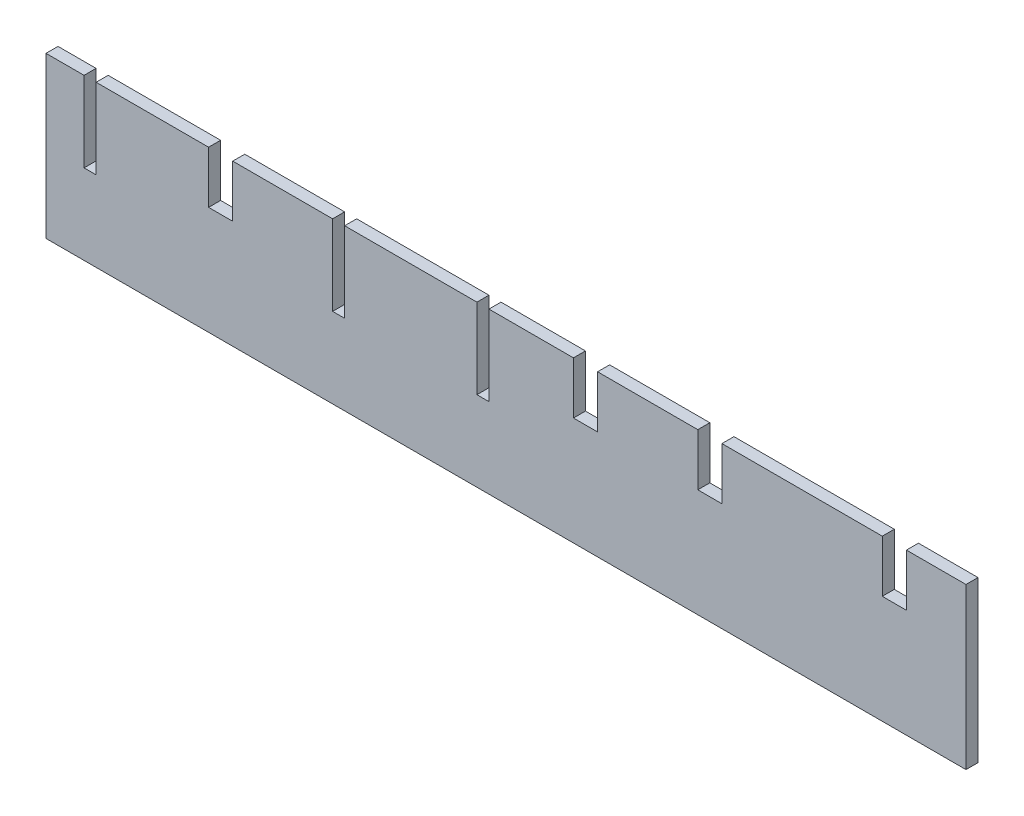
ISO-10303-21;
HEADER;
FILE_DESCRIPTION(('STEP AP214'),'2;1');
FILE_NAME('part.step','',(''),(''),'','','');
FILE_SCHEMA(('AUTOMOTIVE_DESIGN { 1 0 10303 214 1 1 1 1 }'));
ENDSEC;
DATA;
#1=APPLICATION_CONTEXT('core data for automotive mechanical design processes');
#2=APPLICATION_PROTOCOL_DEFINITION('international standard','automotive_design',2000,#1);
#3=PRODUCT_CONTEXT('',#1,'mechanical');
#4=PRODUCT('Part','Part','',(#3));
#5=PRODUCT_RELATED_PRODUCT_CATEGORY('part','',(#4));
#6=PRODUCT_DEFINITION_FORMATION('','',#4);
#7=PRODUCT_DEFINITION_CONTEXT('part definition',#1,'design');
#8=PRODUCT_DEFINITION('design','',#6,#7);
#9=PRODUCT_DEFINITION_SHAPE('','',#8);
#10=(LENGTH_UNIT() NAMED_UNIT(*) SI_UNIT(.MILLI.,.METRE.));
#11=(NAMED_UNIT(*) PLANE_ANGLE_UNIT() SI_UNIT($,.RADIAN.));
#12=(NAMED_UNIT(*) SI_UNIT($,.STERADIAN.) SOLID_ANGLE_UNIT());
#13=UNCERTAINTY_MEASURE_WITH_UNIT(LENGTH_MEASURE(1.E-05),#10,'distance_accuracy_value','');
#14=(GEOMETRIC_REPRESENTATION_CONTEXT(3) GLOBAL_UNCERTAINTY_ASSIGNED_CONTEXT((#13)) GLOBAL_UNIT_ASSIGNED_CONTEXT((#10,
#11,#12)) REPRESENTATION_CONTEXT('',''));
#15=CARTESIAN_POINT('',(0.,0.,0.));
#16=DIRECTION('',(0.,0.,1.));
#17=DIRECTION('',(1.,0.,0.));
#18=AXIS2_PLACEMENT_3D('',#15,#16,#17);
#19=CARTESIAN_POINT('',(14.16,40.,6.));
#20=DIRECTION('',(0.,-1.,0.));
#21=DIRECTION('',(0.,0.,-1.));
#22=AXIS2_PLACEMENT_3D('',#19,#20,#21);
#23=PLANE('',#22);
#24=DIRECTION('',(-1.,0.,0.));
#25=VECTOR('',#24,1.);
#26=CARTESIAN_POINT('',(14.16,40.,0.));
#27=LINE('',#26,#25);
#28=CARTESIAN_POINT('',(136.,40.,0.));
#29=VERTEX_POINT('',#28);
#30=CARTESIAN_POINT('',(70.0000000000001,40.,0.));
#31=VERTEX_POINT('',#30);
#32=EDGE_CURVE('E408',#29,#31,#27,.T.);
#33=ORIENTED_EDGE('',*,*,#32,.T.);
#34=DIRECTION('',(0.,0.,-1.));
#35=VECTOR('',#34,1.);
#36=CARTESIAN_POINT('',(70.0000000000001,40.,10.));
#37=LINE('',#36,#35);
#38=CARTESIAN_POINT('',(70.0000000000001,40.,6.));
#39=VERTEX_POINT('',#38);
#40=EDGE_CURVE('E269',#39,#31,#37,.T.);
#41=ORIENTED_EDGE('',*,*,#40,.F.);
#42=DIRECTION('',(-1.,0.,0.));
#43=VECTOR('',#42,1.);
#44=CARTESIAN_POINT('',(14.16,40.,6.));
#45=LINE('',#44,#43);
#46=CARTESIAN_POINT('',(136.,40.,6.));
#47=VERTEX_POINT('',#46);
#48=EDGE_CURVE('E362',#47,#39,#45,.T.);
#49=ORIENTED_EDGE('',*,*,#48,.F.);
#50=DIRECTION('',(0.,0.,-1.));
#51=VECTOR('',#50,1.);
#52=CARTESIAN_POINT('',(136.,40.,10.));
#53=LINE('',#52,#51);
#54=EDGE_CURVE('E306',#47,#29,#53,.T.);
#55=ORIENTED_EDGE('',*,*,#54,.T.);
#56=EDGE_LOOP('',(#33,#41,#49,#55));
#57=FACE_BOUND('',#56,.T.);
#58=ADVANCED_FACE('F37',(#57),#23,.F.);
#59=CARTESIAN_POINT('',(184.16,40.,0.));
#60=VERTEX_POINT('',#59);
#61=CARTESIAN_POINT('',(142.,40.,0.));
#62=VERTEX_POINT('',#61);
#63=EDGE_CURVE('E404',#60,#62,#27,.T.);
#64=ORIENTED_EDGE('',*,*,#63,.T.);
#65=DIRECTION('',(0.,0.,-1.));
#66=VECTOR('',#65,1.);
#67=CARTESIAN_POINT('',(142.,40.,10.));
#68=LINE('',#67,#66);
#69=CARTESIAN_POINT('',(142.,40.,6.));
#70=VERTEX_POINT('',#69);
#71=EDGE_CURVE('E285',#70,#62,#68,.T.);
#72=ORIENTED_EDGE('',*,*,#71,.F.);
#73=CARTESIAN_POINT('',(184.16,40.,6.));
#74=VERTEX_POINT('',#73);
#75=EDGE_CURVE('E358',#74,#70,#45,.T.);
#76=ORIENTED_EDGE('',*,*,#75,.F.);
#77=DIRECTION('',(0.,0.,-1.));
#78=VECTOR('',#77,1.);
#79=CARTESIAN_POINT('',(184.16,40.,6.));
#80=LINE('',#79,#78);
#81=EDGE_CURVE('E440',#74,#60,#80,.T.);
#82=ORIENTED_EDGE('',*,*,#81,.T.);
#83=EDGE_LOOP('',(#64,#72,#76,#82));
#84=FACE_BOUND('',#83,.T.);
#85=ADVANCED_FACE('F562',(#84),#23,.F.);
#86=CARTESIAN_POINT('',(-79.,40.,6.));
#87=DIRECTION('',(0.,-1.,0.));
#88=DIRECTION('',(1.,0.,0.));
#89=AXIS2_PLACEMENT_3D('',#86,#87,#88);
#90=PLANE('',#89);
#91=DIRECTION('',(-1.,0.,0.));
#92=VECTOR('',#91,1.);
#93=CARTESIAN_POINT('',(-79.,40.,6.));
#94=LINE('',#93,#92);
#95=CARTESIAN_POINT('',(-59.9999999999999,40.,6.));
#96=VERTEX_POINT('',#95);
#97=CARTESIAN_POINT('',(-79.,40.,6.));
#98=VERTEX_POINT('',#97);
#99=EDGE_CURVE('E368',#96,#98,#94,.T.);
#100=ORIENTED_EDGE('',*,*,#99,.F.);
#101=DIRECTION('',(0.,0.,-1.));
#102=VECTOR('',#101,1.);
#103=CARTESIAN_POINT('',(-59.9999999999999,40.,10.));
#104=LINE('',#103,#102);
#105=CARTESIAN_POINT('',(-59.9999999999999,40.,0.));
#106=VERTEX_POINT('',#105);
#107=EDGE_CURVE('E277',#96,#106,#104,.T.);
#108=ORIENTED_EDGE('',*,*,#107,.T.);
#109=DIRECTION('',(-1.,0.,0.));
#110=VECTOR('',#109,1.);
#111=CARTESIAN_POINT('',(-79.,40.,0.));
#112=LINE('',#111,#110);
#113=CARTESIAN_POINT('',(-79.,40.,0.));
#114=VERTEX_POINT('',#113);
#115=EDGE_CURVE('E414',#106,#114,#112,.T.);
#116=ORIENTED_EDGE('',*,*,#115,.T.);
#117=DIRECTION('',(0.,0.,-1.));
#118=VECTOR('',#117,1.);
#119=CARTESIAN_POINT('',(-79.,40.,6.));
#120=LINE('',#119,#118);
#121=EDGE_CURVE('E425',#98,#114,#120,.T.);
#122=ORIENTED_EDGE('',*,*,#121,.F.);
#123=EDGE_LOOP('',(#100,#108,#116,#122));
#124=FACE_BOUND('',#123,.T.);
#125=ADVANCED_FACE('F514',(#124),#90,.F.);
#126=CARTESIAN_POINT('',(380.,40.,6.));
#127=DIRECTION('',(-1.,0.,0.));
#128=DIRECTION('',(0.,0.,1.));
#129=AXIS2_PLACEMENT_3D('',#126,#127,#128);
#130=PLANE('',#129);
#131=DIRECTION('',(0.,1.,0.));
#132=VECTOR('',#131,1.);
#133=CARTESIAN_POINT('',(380.,40.,0.));
#134=LINE('',#133,#132);
#135=CARTESIAN_POINT('',(380.,-40.,0.));
#136=VERTEX_POINT('',#135);
#137=CARTESIAN_POINT('',(380.,40.,0.));
#138=VERTEX_POINT('',#137);
#139=EDGE_CURVE('E328',#136,#138,#134,.T.);
#140=ORIENTED_EDGE('',*,*,#139,.T.);
#141=DIRECTION('',(0.,0.,-1.));
#142=VECTOR('',#141,1.);
#143=CARTESIAN_POINT('',(380.,40.,6.));
#144=LINE('',#143,#142);
#145=CARTESIAN_POINT('',(380.,40.,6.));
#146=VERTEX_POINT('',#145);
#147=EDGE_CURVE('E11',#146,#138,#144,.T.);
#148=ORIENTED_EDGE('',*,*,#147,.F.);
#149=DIRECTION('',(0.,1.,0.));
#150=VECTOR('',#149,1.);
#151=CARTESIAN_POINT('',(380.,40.,6.));
#152=LINE('',#151,#150);
#153=CARTESIAN_POINT('',(380.,-40.,6.));
#154=VERTEX_POINT('',#153);
#155=EDGE_CURVE('E329',#154,#146,#152,.T.);
#156=ORIENTED_EDGE('',*,*,#155,.F.);
#157=DIRECTION('',(0.,0.,-1.));
#158=VECTOR('',#157,1.);
#159=CARTESIAN_POINT('',(380.,-40.,6.));
#160=LINE('',#159,#158);
#161=EDGE_CURVE('E376',#154,#136,#160,.T.);
#162=ORIENTED_EDGE('',*,*,#161,.T.);
#163=EDGE_LOOP('',(#140,#148,#156,#162));
#164=FACE_BOUND('',#163,.T.);
#165=ADVANCED_FACE('F39',(#164),#130,.F.);
#166=CARTESIAN_POINT('',(350.28,40.,6.));
#167=DIRECTION('',(0.,-1.,0.));
#168=DIRECTION('',(0.,0.,-1.));
#169=AXIS2_PLACEMENT_3D('',#166,#167,#168);
#170=PLANE('',#169);
#171=DIRECTION('',(-1.,0.,0.));
#172=VECTOR('',#171,1.);
#173=CARTESIAN_POINT('',(350.28,40.,0.));
#174=LINE('',#173,#172);
#175=CARTESIAN_POINT('',(350.28,40.,0.));
#176=VERTEX_POINT('',#175);
#177=EDGE_CURVE('E379',#138,#176,#174,.T.);
#178=ORIENTED_EDGE('',*,*,#177,.T.);
#179=DIRECTION('',(0.,0.,-1.));
#180=VECTOR('',#179,1.);
#181=CARTESIAN_POINT('',(350.28,40.,6.));
#182=LINE('',#181,#180);
#183=CARTESIAN_POINT('',(350.28,40.,6.));
#184=VERTEX_POINT('',#183);
#185=EDGE_CURVE('E45',#184,#176,#182,.T.);
#186=ORIENTED_EDGE('',*,*,#185,.F.);
#187=DIRECTION('',(-1.,0.,0.));
#188=VECTOR('',#187,1.);
#189=CARTESIAN_POINT('',(350.28,40.,6.));
#190=LINE('',#189,#188);
#191=EDGE_CURVE('E332',#146,#184,#190,.T.);
#192=ORIENTED_EDGE('',*,*,#191,.F.);
#193=ORIENTED_EDGE('',*,*,#147,.T.);
#194=EDGE_LOOP('',(#178,#186,#192,#193));
#195=FACE_BOUND('',#194,.T.);
#196=ADVANCED_FACE('F499',(#195),#170,.F.);
#197=CARTESIAN_POINT('',(350.28,40.,6.));
#198=DIRECTION('',(1.,0.,0.));
#199=DIRECTION('',(0.,0.,-1.));
#200=AXIS2_PLACEMENT_3D('',#197,#198,#199);
#201=PLANE('',#200);
#202=DIRECTION('',(0.,-1.,0.));
#203=VECTOR('',#202,1.);
#204=CARTESIAN_POINT('',(350.28,40.,0.));
#205=LINE('',#204,#203);
#206=CARTESIAN_POINT('',(350.28,14.,0.));
#207=VERTEX_POINT('',#206);
#208=EDGE_CURVE('E381',#176,#207,#205,.T.);
#209=ORIENTED_EDGE('',*,*,#208,.T.);
#210=DIRECTION('',(0.,0.,-1.));
#211=VECTOR('',#210,1.);
#212=CARTESIAN_POINT('',(350.28,14.,6.));
#213=LINE('',#212,#211);
#214=CARTESIAN_POINT('',(350.28,14.,6.));
#215=VERTEX_POINT('',#214);
#216=EDGE_CURVE('E470',#215,#207,#213,.T.);
#217=ORIENTED_EDGE('',*,*,#216,.F.);
#218=DIRECTION('',(0.,-1.,0.));
#219=VECTOR('',#218,1.);
#220=CARTESIAN_POINT('',(350.28,40.,6.));
#221=LINE('',#220,#219);
#222=EDGE_CURVE('E335',#184,#215,#221,.T.);
#223=ORIENTED_EDGE('',*,*,#222,.F.);
#224=ORIENTED_EDGE('',*,*,#185,.T.);
#225=EDGE_LOOP('',(#209,#217,#223,#224));
#226=FACE_BOUND('',#225,.T.);
#227=ADVANCED_FACE('F477',(#226),#201,.F.);
#228=CARTESIAN_POINT('',(338.24,14.,6.));
#229=DIRECTION('',(0.,-1.,0.));
#230=DIRECTION('',(0.,0.,-1.));
#231=AXIS2_PLACEMENT_3D('',#228,#229,#230);
#232=PLANE('',#231);
#233=DIRECTION('',(-1.,0.,0.));
#234=VECTOR('',#233,1.);
#235=CARTESIAN_POINT('',(338.24,14.,0.));
#236=LINE('',#235,#234);
#237=CARTESIAN_POINT('',(338.24,14.,0.));
#238=VERTEX_POINT('',#237);
#239=EDGE_CURVE('E383',#207,#238,#236,.T.);
#240=ORIENTED_EDGE('',*,*,#239,.T.);
#241=DIRECTION('',(0.,0.,-1.));
#242=VECTOR('',#241,1.);
#243=CARTESIAN_POINT('',(338.24,14.,6.));
#244=LINE('',#243,#242);
#245=CARTESIAN_POINT('',(338.24,14.,6.));
#246=VERTEX_POINT('',#245);
#247=EDGE_CURVE('E467',#246,#238,#244,.T.);
#248=ORIENTED_EDGE('',*,*,#247,.F.);
#249=DIRECTION('',(-1.,0.,0.));
#250=VECTOR('',#249,1.);
#251=CARTESIAN_POINT('',(338.24,14.,6.));
#252=LINE('',#251,#250);
#253=EDGE_CURVE('E337',#215,#246,#252,.T.);
#254=ORIENTED_EDGE('',*,*,#253,.F.);
#255=ORIENTED_EDGE('',*,*,#216,.T.);
#256=EDGE_LOOP('',(#240,#248,#254,#255));
#257=FACE_BOUND('',#256,.T.);
#258=ADVANCED_FACE('F486',(#257),#232,.F.);
#259=CARTESIAN_POINT('',(338.24,40.,6.));
#260=DIRECTION('',(-1.,0.,0.));
#261=DIRECTION('',(0.,0.,1.));
#262=AXIS2_PLACEMENT_3D('',#259,#260,#261);
#263=PLANE('',#262);
#264=DIRECTION('',(0.,1.,0.));
#265=VECTOR('',#264,1.);
#266=CARTESIAN_POINT('',(338.24,40.,0.));
#267=LINE('',#266,#265);
#268=CARTESIAN_POINT('',(338.24,40.,0.));
#269=VERTEX_POINT('',#268);
#270=EDGE_CURVE('E385',#238,#269,#267,.T.);
#271=ORIENTED_EDGE('',*,*,#270,.T.);
#272=DIRECTION('',(0.,0.,-1.));
#273=VECTOR('',#272,1.);
#274=CARTESIAN_POINT('',(338.24,40.,6.));
#275=LINE('',#274,#273);
#276=CARTESIAN_POINT('',(338.24,40.,6.));
#277=VERTEX_POINT('',#276);
#278=EDGE_CURVE('E464',#277,#269,#275,.T.);
#279=ORIENTED_EDGE('',*,*,#278,.F.);
#280=DIRECTION('',(0.,1.,0.));
#281=VECTOR('',#280,1.);
#282=CARTESIAN_POINT('',(338.24,40.,6.));
#283=LINE('',#282,#281);
#284=EDGE_CURVE('E339',#246,#277,#283,.T.);
#285=ORIENTED_EDGE('',*,*,#284,.F.);
#286=ORIENTED_EDGE('',*,*,#247,.T.);
#287=EDGE_LOOP('',(#271,#279,#285,#286));
#288=FACE_BOUND('',#287,.T.);
#289=ADVANCED_FACE('F490',(#288),#263,.F.);
#290=CARTESIAN_POINT('',(258.24,40.,6.));
#291=DIRECTION('',(0.,-1.,0.));
#292=DIRECTION('',(0.,0.,-1.));
#293=AXIS2_PLACEMENT_3D('',#290,#291,#292);
#294=PLANE('',#293);
#295=DIRECTION('',(-1.,0.,0.));
#296=VECTOR('',#295,1.);
#297=CARTESIAN_POINT('',(258.24,40.,0.));
#298=LINE('',#297,#296);
#299=CARTESIAN_POINT('',(258.24,40.,0.));
#300=VERTEX_POINT('',#299);
#301=EDGE_CURVE('E387',#269,#300,#298,.T.);
#302=ORIENTED_EDGE('',*,*,#301,.T.);
#303=DIRECTION('',(0.,0.,-1.));
#304=VECTOR('',#303,1.);
#305=CARTESIAN_POINT('',(258.24,40.,6.));
#306=LINE('',#305,#304);
#307=CARTESIAN_POINT('',(258.24,40.,6.));
#308=VERTEX_POINT('',#307);
#309=EDGE_CURVE('E461',#308,#300,#306,.T.);
#310=ORIENTED_EDGE('',*,*,#309,.F.);
#311=DIRECTION('',(-1.,0.,0.));
#312=VECTOR('',#311,1.);
#313=CARTESIAN_POINT('',(258.24,40.,6.));
#314=LINE('',#313,#312);
#315=EDGE_CURVE('E341',#277,#308,#314,.T.);
#316=ORIENTED_EDGE('',*,*,#315,.F.);
#317=ORIENTED_EDGE('',*,*,#278,.T.);
#318=EDGE_LOOP('',(#302,#310,#316,#317));
#319=FACE_BOUND('',#318,.T.);
#320=ADVANCED_FACE('F619',(#319),#294,.F.);
#321=CARTESIAN_POINT('',(258.24,40.,6.));
#322=DIRECTION('',(1.,0.,0.));
#323=DIRECTION('',(0.,0.,-1.));
#324=AXIS2_PLACEMENT_3D('',#321,#322,#323);
#325=PLANE('',#324);
#326=DIRECTION('',(0.,-1.,0.));
#327=VECTOR('',#326,1.);
#328=CARTESIAN_POINT('',(258.24,40.,0.));
#329=LINE('',#328,#327);
#330=CARTESIAN_POINT('',(258.24,14.,0.));
#331=VERTEX_POINT('',#330);
#332=EDGE_CURVE('E389',#300,#331,#329,.T.);
#333=ORIENTED_EDGE('',*,*,#332,.T.);
#334=DIRECTION('',(0.,0.,-1.));
#335=VECTOR('',#334,1.);
#336=CARTESIAN_POINT('',(258.24,14.,6.));
#337=LINE('',#336,#335);
#338=CARTESIAN_POINT('',(258.24,14.,6.));
#339=VERTEX_POINT('',#338);
#340=EDGE_CURVE('E458',#339,#331,#337,.T.);
#341=ORIENTED_EDGE('',*,*,#340,.F.);
#342=DIRECTION('',(0.,-1.,0.));
#343=VECTOR('',#342,1.);
#344=CARTESIAN_POINT('',(258.24,40.,6.));
#345=LINE('',#344,#343);
#346=EDGE_CURVE('E343',#308,#339,#345,.T.);
#347=ORIENTED_EDGE('',*,*,#346,.F.);
#348=ORIENTED_EDGE('',*,*,#309,.T.);
#349=EDGE_LOOP('',(#333,#341,#347,#348));
#350=FACE_BOUND('',#349,.T.);
#351=ADVANCED_FACE('F617',(#350),#325,.F.);
#352=CARTESIAN_POINT('',(258.24,14.,6.));
#353=DIRECTION('',(0.,-1.,0.));
#354=DIRECTION('',(1.,0.,0.));
#355=AXIS2_PLACEMENT_3D('',#352,#353,#354);
#356=PLANE('',#355);
#357=DIRECTION('',(-1.,0.,0.));
#358=VECTOR('',#357,1.);
#359=CARTESIAN_POINT('',(258.24,14.,0.));
#360=LINE('',#359,#358);
#361=CARTESIAN_POINT('',(246.2,14.,0.));
#362=VERTEX_POINT('',#361);
#363=EDGE_CURVE('E391',#331,#362,#360,.T.);
#364=ORIENTED_EDGE('',*,*,#363,.T.);
#365=DIRECTION('',(0.,0.,-1.));
#366=VECTOR('',#365,1.);
#367=CARTESIAN_POINT('',(246.2,14.,6.));
#368=LINE('',#367,#366);
#369=CARTESIAN_POINT('',(246.2,14.,6.));
#370=VERTEX_POINT('',#369);
#371=EDGE_CURVE('E455',#370,#362,#368,.T.);
#372=ORIENTED_EDGE('',*,*,#371,.F.);
#373=DIRECTION('',(-1.,0.,0.));
#374=VECTOR('',#373,1.);
#375=CARTESIAN_POINT('',(258.24,14.,6.));
#376=LINE('',#375,#374);
#377=EDGE_CURVE('E345',#339,#370,#376,.T.);
#378=ORIENTED_EDGE('',*,*,#377,.F.);
#379=ORIENTED_EDGE('',*,*,#340,.T.);
#380=EDGE_LOOP('',(#364,#372,#378,#379));
#381=FACE_BOUND('',#380,.T.);
#382=ADVANCED_FACE('F612',(#381),#356,.F.);
#383=CARTESIAN_POINT('',(246.2,14.,6.));
#384=DIRECTION('',(-1.,0.,0.));
#385=DIRECTION('',(0.,0.,1.));
#386=AXIS2_PLACEMENT_3D('',#383,#384,#385);
#387=PLANE('',#386);
#388=DIRECTION('',(0.,1.,0.));
#389=VECTOR('',#388,1.);
#390=CARTESIAN_POINT('',(246.2,14.,0.));
#391=LINE('',#390,#389);
#392=CARTESIAN_POINT('',(246.2,40.,0.));
#393=VERTEX_POINT('',#392);
#394=EDGE_CURVE('E393',#362,#393,#391,.T.);
#395=ORIENTED_EDGE('',*,*,#394,.T.);
#396=DIRECTION('',(0.,0.,-1.));
#397=VECTOR('',#396,1.);
#398=CARTESIAN_POINT('',(246.2,40.,6.));
#399=LINE('',#398,#397);
#400=CARTESIAN_POINT('',(246.2,40.,6.));
#401=VERTEX_POINT('',#400);
#402=EDGE_CURVE('E452',#401,#393,#399,.T.);
#403=ORIENTED_EDGE('',*,*,#402,.F.);
#404=DIRECTION('',(0.,1.,0.));
#405=VECTOR('',#404,1.);
#406=CARTESIAN_POINT('',(246.2,14.,6.));
#407=LINE('',#406,#405);
#408=EDGE_CURVE('E347',#370,#401,#407,.T.);
#409=ORIENTED_EDGE('',*,*,#408,.F.);
#410=ORIENTED_EDGE('',*,*,#371,.T.);
#411=EDGE_LOOP('',(#395,#403,#409,#410));
#412=FACE_BOUND('',#411,.T.);
#413=ADVANCED_FACE('F607',(#412),#387,.F.);
#414=CARTESIAN_POINT('',(196.2,40.,6.));
#415=DIRECTION('',(0.,-1.,0.));
#416=DIRECTION('',(0.,0.,-1.));
#417=AXIS2_PLACEMENT_3D('',#414,#415,#416);
#418=PLANE('',#417);
#419=DIRECTION('',(-1.,0.,0.));
#420=VECTOR('',#419,1.);
#421=CARTESIAN_POINT('',(196.2,40.,0.));
#422=LINE('',#421,#420);
#423=CARTESIAN_POINT('',(196.2,40.,0.));
#424=VERTEX_POINT('',#423);
#425=EDGE_CURVE('E395',#393,#424,#422,.T.);
#426=ORIENTED_EDGE('',*,*,#425,.T.);
#427=DIRECTION('',(0.,0.,-1.));
#428=VECTOR('',#427,1.);
#429=CARTESIAN_POINT('',(196.2,40.,6.));
#430=LINE('',#429,#428);
#431=CARTESIAN_POINT('',(196.2,40.,6.));
#432=VERTEX_POINT('',#431);
#433=EDGE_CURVE('E449',#432,#424,#430,.T.);
#434=ORIENTED_EDGE('',*,*,#433,.F.);
#435=DIRECTION('',(-1.,0.,0.));
#436=VECTOR('',#435,1.);
#437=CARTESIAN_POINT('',(196.2,40.,6.));
#438=LINE('',#437,#436);
#439=EDGE_CURVE('E349',#401,#432,#438,.T.);
#440=ORIENTED_EDGE('',*,*,#439,.F.);
#441=ORIENTED_EDGE('',*,*,#402,.T.);
#442=EDGE_LOOP('',(#426,#434,#440,#441));
#443=FACE_BOUND('',#442,.T.);
#444=ADVANCED_FACE('F603',(#443),#418,.F.);
#445=CARTESIAN_POINT('',(196.2,14.,6.));
#446=DIRECTION('',(1.,0.,0.));
#447=DIRECTION('',(0.,0.,-1.));
#448=AXIS2_PLACEMENT_3D('',#445,#446,#447);
#449=PLANE('',#448);
#450=DIRECTION('',(0.,-1.,0.));
#451=VECTOR('',#450,1.);
#452=CARTESIAN_POINT('',(196.2,14.,0.));
#453=LINE('',#452,#451);
#454=CARTESIAN_POINT('',(196.2,14.,0.));
#455=VERTEX_POINT('',#454);
#456=EDGE_CURVE('E397',#424,#455,#453,.T.);
#457=ORIENTED_EDGE('',*,*,#456,.T.);
#458=DIRECTION('',(0.,0.,-1.));
#459=VECTOR('',#458,1.);
#460=CARTESIAN_POINT('',(196.2,14.,6.));
#461=LINE('',#460,#459);
#462=CARTESIAN_POINT('',(196.2,14.,6.));
#463=VERTEX_POINT('',#462);
#464=EDGE_CURVE('E446',#463,#455,#461,.T.);
#465=ORIENTED_EDGE('',*,*,#464,.F.);
#466=DIRECTION('',(0.,-1.,0.));
#467=VECTOR('',#466,1.);
#468=CARTESIAN_POINT('',(196.2,14.,6.));
#469=LINE('',#468,#467);
#470=EDGE_CURVE('E351',#432,#463,#469,.T.);
#471=ORIENTED_EDGE('',*,*,#470,.F.);
#472=ORIENTED_EDGE('',*,*,#433,.T.);
#473=EDGE_LOOP('',(#457,#465,#471,#472));
#474=FACE_BOUND('',#473,.T.);
#475=ADVANCED_FACE('F598',(#474),#449,.F.);
#476=CARTESIAN_POINT('',(184.16,14.,6.));
#477=DIRECTION('',(0.,-1.,0.));
#478=DIRECTION('',(0.,0.,-1.));
#479=AXIS2_PLACEMENT_3D('',#476,#477,#478);
#480=PLANE('',#479);
#481=DIRECTION('',(-1.,0.,0.));
#482=VECTOR('',#481,1.);
#483=CARTESIAN_POINT('',(184.16,14.,0.));
#484=LINE('',#483,#482);
#485=CARTESIAN_POINT('',(184.16,14.,0.));
#486=VERTEX_POINT('',#485);
#487=EDGE_CURVE('E399',#455,#486,#484,.T.);
#488=ORIENTED_EDGE('',*,*,#487,.T.);
#489=DIRECTION('',(0.,0.,-1.));
#490=VECTOR('',#489,1.);
#491=CARTESIAN_POINT('',(184.16,14.,6.));
#492=LINE('',#491,#490);
#493=CARTESIAN_POINT('',(184.16,14.,6.));
#494=VERTEX_POINT('',#493);
#495=EDGE_CURVE('E443',#494,#486,#492,.T.);
#496=ORIENTED_EDGE('',*,*,#495,.F.);
#497=DIRECTION('',(-1.,0.,0.));
#498=VECTOR('',#497,1.);
#499=CARTESIAN_POINT('',(184.16,14.,6.));
#500=LINE('',#499,#498);
#501=EDGE_CURVE('E353',#463,#494,#500,.T.);
#502=ORIENTED_EDGE('',*,*,#501,.F.);
#503=ORIENTED_EDGE('',*,*,#464,.T.);
#504=EDGE_LOOP('',(#488,#496,#502,#503));
#505=FACE_BOUND('',#504,.T.);
#506=ADVANCED_FACE('F568',(#505),#480,.F.);
#507=CARTESIAN_POINT('',(184.16,14.,6.));
#508=DIRECTION('',(-1.,0.,0.));
#509=DIRECTION('',(0.,0.,1.));
#510=AXIS2_PLACEMENT_3D('',#507,#508,#509);
#511=PLANE('',#510);
#512=DIRECTION('',(0.,1.,0.));
#513=VECTOR('',#512,1.);
#514=CARTESIAN_POINT('',(184.16,14.,0.));
#515=LINE('',#514,#513);
#516=EDGE_CURVE('E401',#486,#60,#515,.T.);
#517=ORIENTED_EDGE('',*,*,#516,.T.);
#518=ORIENTED_EDGE('',*,*,#81,.F.);
#519=DIRECTION('',(0.,1.,0.));
#520=VECTOR('',#519,1.);
#521=CARTESIAN_POINT('',(184.16,14.,6.));
#522=LINE('',#521,#520);
#523=EDGE_CURVE('E355',#494,#74,#522,.T.);
#524=ORIENTED_EDGE('',*,*,#523,.F.);
#525=ORIENTED_EDGE('',*,*,#495,.T.);
#526=EDGE_LOOP('',(#517,#518,#524,#525));
#527=FACE_BOUND('',#526,.T.);
#528=ADVANCED_FACE('F560',(#527),#511,.F.);
#529=CARTESIAN_POINT('',(64.0000000000001,40.,6.));
#530=VERTEX_POINT('',#529);
#531=CARTESIAN_POINT('',(14.16,40.,6.));
#532=VERTEX_POINT('',#531);
#533=EDGE_CURVE('E357',#530,#532,#45,.T.);
#534=ORIENTED_EDGE('',*,*,#533,.F.);
#535=DIRECTION('',(0.,0.,-1.));
#536=VECTOR('',#535,1.);
#537=CARTESIAN_POINT('',(64.0000000000001,40.,10.));
#538=LINE('',#537,#536);
#539=CARTESIAN_POINT('',(64.0000000000001,40.,0.));
#540=VERTEX_POINT('',#539);
#541=EDGE_CURVE('E292',#530,#540,#538,.T.);
#542=ORIENTED_EDGE('',*,*,#541,.T.);
#543=CARTESIAN_POINT('',(14.16,40.,0.));
#544=VERTEX_POINT('',#543);
#545=EDGE_CURVE('E403',#540,#544,#27,.T.);
#546=ORIENTED_EDGE('',*,*,#545,.T.);
#547=DIRECTION('',(0.,0.,-1.));
#548=VECTOR('',#547,1.);
#549=CARTESIAN_POINT('',(14.16,40.,6.));
#550=LINE('',#549,#548);
#551=EDGE_CURVE('E437',#532,#544,#550,.T.);
#552=ORIENTED_EDGE('',*,*,#551,.F.);
#553=EDGE_LOOP('',(#534,#542,#546,#552));
#554=FACE_BOUND('',#553,.T.);
#555=ADVANCED_FACE('F558',(#554),#23,.F.);
#556=CARTESIAN_POINT('',(14.16,14.,6.));
#557=DIRECTION('',(1.,0.,0.));
#558=DIRECTION('',(0.,0.,-1.));
#559=AXIS2_PLACEMENT_3D('',#556,#557,#558);
#560=PLANE('',#559);
#561=DIRECTION('',(0.,-1.,0.));
#562=VECTOR('',#561,1.);
#563=CARTESIAN_POINT('',(14.16,14.,0.));
#564=LINE('',#563,#562);
#565=CARTESIAN_POINT('',(14.16,14.,0.));
#566=VERTEX_POINT('',#565);
#567=EDGE_CURVE('E407',#544,#566,#564,.T.);
#568=ORIENTED_EDGE('',*,*,#567,.T.);
#569=DIRECTION('',(0.,0.,-1.));
#570=VECTOR('',#569,1.);
#571=CARTESIAN_POINT('',(14.16,14.,6.));
#572=LINE('',#571,#570);
#573=CARTESIAN_POINT('',(14.16,14.,6.));
#574=VERTEX_POINT('',#573);
#575=EDGE_CURVE('E434',#574,#566,#572,.T.);
#576=ORIENTED_EDGE('',*,*,#575,.F.);
#577=DIRECTION('',(0.,-1.,0.));
#578=VECTOR('',#577,1.);
#579=CARTESIAN_POINT('',(14.16,14.,6.));
#580=LINE('',#579,#578);
#581=EDGE_CURVE('E361',#532,#574,#580,.T.);
#582=ORIENTED_EDGE('',*,*,#581,.F.);
#583=ORIENTED_EDGE('',*,*,#551,.T.);
#584=EDGE_LOOP('',(#568,#576,#582,#583));
#585=FACE_BOUND('',#584,.T.);
#586=ADVANCED_FACE('F534',(#585),#560,.F.);
#587=CARTESIAN_POINT('',(2.12000000000001,14.,6.));
#588=DIRECTION('',(0.,-1.,0.));
#589=DIRECTION('',(0.,0.,-1.));
#590=AXIS2_PLACEMENT_3D('',#587,#588,#589);
#591=PLANE('',#590);
#592=DIRECTION('',(-1.,0.,0.));
#593=VECTOR('',#592,1.);
#594=CARTESIAN_POINT('',(2.12000000000001,14.,0.));
#595=LINE('',#594,#593);
#596=CARTESIAN_POINT('',(2.12000000000001,14.,0.));
#597=VERTEX_POINT('',#596);
#598=EDGE_CURVE('E410',#566,#597,#595,.T.);
#599=ORIENTED_EDGE('',*,*,#598,.T.);
#600=DIRECTION('',(0.,0.,-1.));
#601=VECTOR('',#600,1.);
#602=CARTESIAN_POINT('',(2.12000000000001,14.,6.));
#603=LINE('',#602,#601);
#604=CARTESIAN_POINT('',(2.12000000000001,14.,6.));
#605=VERTEX_POINT('',#604);
#606=EDGE_CURVE('E431',#605,#597,#603,.T.);
#607=ORIENTED_EDGE('',*,*,#606,.F.);
#608=DIRECTION('',(-1.,0.,0.));
#609=VECTOR('',#608,1.);
#610=CARTESIAN_POINT('',(2.12000000000001,14.,6.));
#611=LINE('',#610,#609);
#612=EDGE_CURVE('E364',#574,#605,#611,.T.);
#613=ORIENTED_EDGE('',*,*,#612,.F.);
#614=ORIENTED_EDGE('',*,*,#575,.T.);
#615=EDGE_LOOP('',(#599,#607,#613,#614));
#616=FACE_BOUND('',#615,.T.);
#617=ADVANCED_FACE('F530',(#616),#591,.F.);
#618=CARTESIAN_POINT('',(2.12000000000001,14.,6.));
#619=DIRECTION('',(-1.,0.,0.));
#620=DIRECTION('',(0.,0.,1.));
#621=AXIS2_PLACEMENT_3D('',#618,#619,#620);
#622=PLANE('',#621);
#623=DIRECTION('',(0.,1.,0.));
#624=VECTOR('',#623,1.);
#625=CARTESIAN_POINT('',(2.12000000000001,14.,0.));
#626=LINE('',#625,#624);
#627=CARTESIAN_POINT('',(2.12000000000001,40.,0.));
#628=VERTEX_POINT('',#627);
#629=EDGE_CURVE('E412',#597,#628,#626,.T.);
#630=ORIENTED_EDGE('',*,*,#629,.T.);
#631=DIRECTION('',(0.,0.,-1.));
#632=VECTOR('',#631,1.);
#633=CARTESIAN_POINT('',(2.12000000000001,40.,6.));
#634=LINE('',#633,#632);
#635=CARTESIAN_POINT('',(2.12000000000001,40.,6.));
#636=VERTEX_POINT('',#635);
#637=EDGE_CURVE('E428',#636,#628,#634,.T.);
#638=ORIENTED_EDGE('',*,*,#637,.F.);
#639=DIRECTION('',(0.,1.,0.));
#640=VECTOR('',#639,1.);
#641=CARTESIAN_POINT('',(2.12000000000001,14.,6.));
#642=LINE('',#641,#640);
#643=EDGE_CURVE('E366',#605,#636,#642,.T.);
#644=ORIENTED_EDGE('',*,*,#643,.F.);
#645=ORIENTED_EDGE('',*,*,#606,.T.);
#646=EDGE_LOOP('',(#630,#638,#644,#645));
#647=FACE_BOUND('',#646,.T.);
#648=ADVANCED_FACE('F525',(#647),#622,.F.);
#649=CARTESIAN_POINT('',(-53.9999999999999,40.,0.));
#650=VERTEX_POINT('',#649);
#651=EDGE_CURVE('E415',#628,#650,#112,.T.);
#652=ORIENTED_EDGE('',*,*,#651,.T.);
#653=DIRECTION('',(0.,0.,-1.));
#654=VECTOR('',#653,1.);
#655=CARTESIAN_POINT('',(-53.9999999999999,40.,10.));
#656=LINE('',#655,#654);
#657=CARTESIAN_POINT('',(-53.9999999999999,40.,6.));
#658=VERTEX_POINT('',#657);
#659=EDGE_CURVE('E260',#658,#650,#656,.T.);
#660=ORIENTED_EDGE('',*,*,#659,.F.);
#661=EDGE_CURVE('E369',#636,#658,#94,.T.);
#662=ORIENTED_EDGE('',*,*,#661,.F.);
#663=ORIENTED_EDGE('',*,*,#637,.T.);
#664=EDGE_LOOP('',(#652,#660,#662,#663));
#665=FACE_BOUND('',#664,.T.);
#666=ADVANCED_FACE('F519',(#665),#90,.F.);
#667=CARTESIAN_POINT('',(-79.,40.,6.));
#668=DIRECTION('',(1.,0.,0.));
#669=DIRECTION('',(0.,0.,-1.));
#670=AXIS2_PLACEMENT_3D('',#667,#668,#669);
#671=PLANE('',#670);
#672=DIRECTION('',(0.,-1.,0.));
#673=VECTOR('',#672,1.);
#674=CARTESIAN_POINT('',(-79.,40.,0.));
#675=LINE('',#674,#673);
#676=CARTESIAN_POINT('',(-79.,-40.,0.));
#677=VERTEX_POINT('',#676);
#678=EDGE_CURVE('E417',#114,#677,#675,.T.);
#679=ORIENTED_EDGE('',*,*,#678,.T.);
#680=DIRECTION('',(0.,0.,-1.));
#681=VECTOR('',#680,1.);
#682=CARTESIAN_POINT('',(-79.,-40.,6.));
#683=LINE('',#682,#681);
#684=CARTESIAN_POINT('',(-79.,-40.,6.));
#685=VERTEX_POINT('',#684);
#686=EDGE_CURVE('E422',#685,#677,#683,.T.);
#687=ORIENTED_EDGE('',*,*,#686,.F.);
#688=DIRECTION('',(0.,-1.,0.));
#689=VECTOR('',#688,1.);
#690=CARTESIAN_POINT('',(-79.,40.,6.));
#691=LINE('',#690,#689);
#692=EDGE_CURVE('E372',#98,#685,#691,.T.);
#693=ORIENTED_EDGE('',*,*,#692,.F.);
#694=ORIENTED_EDGE('',*,*,#121,.T.);
#695=EDGE_LOOP('',(#679,#687,#693,#694));
#696=FACE_BOUND('',#695,.T.);
#697=ADVANCED_FACE('F510',(#696),#671,.F.);
#698=CARTESIAN_POINT('',(-79.,-40.,6.));
#699=DIRECTION('',(0.,1.,0.));
#700=DIRECTION('',(-1.,0.,0.));
#701=AXIS2_PLACEMENT_3D('',#698,#699,#700);
#702=PLANE('',#701);
#703=DIRECTION('',(1.,0.,0.));
#704=VECTOR('',#703,1.);
#705=CARTESIAN_POINT('',(-79.,-40.,0.));
#706=LINE('',#705,#704);
#707=EDGE_CURVE('E333',#677,#136,#706,.T.);
#708=ORIENTED_EDGE('',*,*,#707,.T.);
#709=ORIENTED_EDGE('',*,*,#161,.F.);
#710=DIRECTION('',(1.,0.,0.));
#711=VECTOR('',#710,1.);
#712=CARTESIAN_POINT('',(-79.,-40.,6.));
#713=LINE('',#712,#711);
#714=EDGE_CURVE('E374',#685,#154,#713,.T.);
#715=ORIENTED_EDGE('',*,*,#714,.F.);
#716=ORIENTED_EDGE('',*,*,#686,.T.);
#717=EDGE_LOOP('',(#708,#709,#715,#716));
#718=FACE_BOUND('',#717,.T.);
#719=ADVANCED_FACE('F505',(#718),#702,.F.);
#720=CARTESIAN_POINT('',(0.,0.,6.));
#721=DIRECTION('',(0.,0.,1.));
#722=DIRECTION('',(1.,0.,0.));
#723=AXIS2_PLACEMENT_3D('',#720,#721,#722);
#724=PLANE('',#723);
#725=DIRECTION('',(0.,-1.,0.));
#726=VECTOR('',#725,1.);
#727=CARTESIAN_POINT('',(-59.9999999999999,0.,6.));
#728=LINE('',#727,#726);
#729=CARTESIAN_POINT('',(-59.9999999999999,0.,6.));
#730=VERTEX_POINT('',#729);
#731=EDGE_CURVE('E326',#96,#730,#728,.T.);
#732=ORIENTED_EDGE('',*,*,#731,.F.);
#733=ORIENTED_EDGE('',*,*,#99,.T.);
#734=ORIENTED_EDGE('',*,*,#692,.T.);
#735=ORIENTED_EDGE('',*,*,#714,.T.);
#736=ORIENTED_EDGE('',*,*,#155,.T.);
#737=ORIENTED_EDGE('',*,*,#191,.T.);
#738=ORIENTED_EDGE('',*,*,#222,.T.);
#739=ORIENTED_EDGE('',*,*,#253,.T.);
#740=ORIENTED_EDGE('',*,*,#284,.T.);
#741=ORIENTED_EDGE('',*,*,#315,.T.);
#742=ORIENTED_EDGE('',*,*,#346,.T.);
#743=ORIENTED_EDGE('',*,*,#377,.T.);
#744=ORIENTED_EDGE('',*,*,#408,.T.);
#745=ORIENTED_EDGE('',*,*,#439,.T.);
#746=ORIENTED_EDGE('',*,*,#470,.T.);
#747=ORIENTED_EDGE('',*,*,#501,.T.);
#748=ORIENTED_EDGE('',*,*,#523,.T.);
#749=ORIENTED_EDGE('',*,*,#75,.T.);
#750=DIRECTION('',(0.,1.,0.));
#751=VECTOR('',#750,1.);
#752=CARTESIAN_POINT('',(142.,0.,6.));
#753=LINE('',#752,#751);
#754=CARTESIAN_POINT('',(142.,0.,6.));
#755=VERTEX_POINT('',#754);
#756=EDGE_CURVE('E315',#755,#70,#753,.T.);
#757=ORIENTED_EDGE('',*,*,#756,.F.);
#758=DIRECTION('',(1.,0.,0.));
#759=VECTOR('',#758,1.);
#760=CARTESIAN_POINT('',(0.,0.,6.));
#761=LINE('',#760,#759);
#762=CARTESIAN_POINT('',(136.,0.,6.));
#763=VERTEX_POINT('',#762);
#764=EDGE_CURVE('E280',#763,#755,#761,.T.);
#765=ORIENTED_EDGE('',*,*,#764,.F.);
#766=DIRECTION('',(0.,-1.,0.));
#767=VECTOR('',#766,1.);
#768=CARTESIAN_POINT('',(136.,0.,6.));
#769=LINE('',#768,#767);
#770=EDGE_CURVE('E313',#47,#763,#769,.T.);
#771=ORIENTED_EDGE('',*,*,#770,.F.);
#772=ORIENTED_EDGE('',*,*,#48,.T.);
#773=DIRECTION('',(0.,1.,0.));
#774=VECTOR('',#773,1.);
#775=CARTESIAN_POINT('',(70.0000000000001,0.,6.));
#776=LINE('',#775,#774);
#777=CARTESIAN_POINT('',(70.0000000000001,0.,6.));
#778=VERTEX_POINT('',#777);
#779=EDGE_CURVE('E321',#778,#39,#776,.T.);
#780=ORIENTED_EDGE('',*,*,#779,.F.);
#781=DIRECTION('',(1.,0.,0.));
#782=VECTOR('',#781,1.);
#783=CARTESIAN_POINT('',(0.,0.,6.));
#784=LINE('',#783,#782);
#785=CARTESIAN_POINT('',(64.0000000000001,0.,6.));
#786=VERTEX_POINT('',#785);
#787=EDGE_CURVE('E317',#786,#778,#784,.T.);
#788=ORIENTED_EDGE('',*,*,#787,.F.);
#789=DIRECTION('',(0.,-1.,0.));
#790=VECTOR('',#789,1.);
#791=CARTESIAN_POINT('',(64.0000000000001,0.,6.));
#792=LINE('',#791,#790);
#793=EDGE_CURVE('E319',#530,#786,#792,.T.);
#794=ORIENTED_EDGE('',*,*,#793,.F.);
#795=ORIENTED_EDGE('',*,*,#533,.T.);
#796=ORIENTED_EDGE('',*,*,#581,.T.);
#797=ORIENTED_EDGE('',*,*,#612,.T.);
#798=ORIENTED_EDGE('',*,*,#643,.T.);
#799=ORIENTED_EDGE('',*,*,#661,.T.);
#800=DIRECTION('',(0.,1.,0.));
#801=VECTOR('',#800,1.);
#802=CARTESIAN_POINT('',(-53.9999999999999,0.,6.));
#803=LINE('',#802,#801);
#804=CARTESIAN_POINT('',(-53.9999999999999,0.,6.));
#805=VERTEX_POINT('',#804);
#806=EDGE_CURVE('E323',#805,#658,#803,.T.);
#807=ORIENTED_EDGE('',*,*,#806,.F.);
#808=DIRECTION('',(1.,0.,0.));
#809=VECTOR('',#808,1.);
#810=CARTESIAN_POINT('',(0.,0.,6.));
#811=LINE('',#810,#809);
#812=EDGE_CURVE('E256',#730,#805,#811,.T.);
#813=ORIENTED_EDGE('',*,*,#812,.F.);
#814=EDGE_LOOP('',(#732,#733,#734,#735,#736,#737,#738,#739,#740,#741,#742,#743,#744,#745,#746,
#747,#748,#749,#757,#765,#771,#772,#780,#788,#794,#795,#796,#797,#798,#799,#807,#813));
#815=FACE_BOUND('',#814,.T.);
#816=ADVANCED_FACE('F495',(#815),#724,.T.);
#817=CARTESIAN_POINT('',(0.,0.,0.));
#818=DIRECTION('',(0.,0.,1.));
#819=DIRECTION('',(1.,0.,0.));
#820=AXIS2_PLACEMENT_3D('',#817,#818,#819);
#821=PLANE('',#820);
#822=ORIENTED_EDGE('',*,*,#115,.F.);
#823=DIRECTION('',(0.,1.,0.));
#824=VECTOR('',#823,1.);
#825=CARTESIAN_POINT('',(-59.9999999999999,40.,0.));
#826=LINE('',#825,#824);
#827=CARTESIAN_POINT('',(-59.9999999999999,0.,0.));
#828=VERTEX_POINT('',#827);
#829=EDGE_CURVE('E273',#828,#106,#826,.T.);
#830=ORIENTED_EDGE('',*,*,#829,.F.);
#831=DIRECTION('',(-1.,0.,0.));
#832=VECTOR('',#831,1.);
#833=CARTESIAN_POINT('',(-53.9999999999999,0.,0.));
#834=LINE('',#833,#832);
#835=CARTESIAN_POINT('',(-53.9999999999999,0.,0.));
#836=VERTEX_POINT('',#835);
#837=EDGE_CURVE('E253',#836,#828,#834,.T.);
#838=ORIENTED_EDGE('',*,*,#837,.F.);
#839=DIRECTION('',(0.,-1.,0.));
#840=VECTOR('',#839,1.);
#841=CARTESIAN_POINT('',(-53.9999999999999,0.,0.));
#842=LINE('',#841,#840);
#843=EDGE_CURVE('E263',#650,#836,#842,.T.);
#844=ORIENTED_EDGE('',*,*,#843,.F.);
#845=ORIENTED_EDGE('',*,*,#651,.F.);
#846=ORIENTED_EDGE('',*,*,#629,.F.);
#847=ORIENTED_EDGE('',*,*,#598,.F.);
#848=ORIENTED_EDGE('',*,*,#567,.F.);
#849=ORIENTED_EDGE('',*,*,#545,.F.);
#850=DIRECTION('',(0.,1.,0.));
#851=VECTOR('',#850,1.);
#852=CARTESIAN_POINT('',(64.0000000000001,40.,0.));
#853=LINE('',#852,#851);
#854=CARTESIAN_POINT('',(64.0000000000001,0.,0.));
#855=VERTEX_POINT('',#854);
#856=EDGE_CURVE('E288',#855,#540,#853,.T.);
#857=ORIENTED_EDGE('',*,*,#856,.F.);
#858=DIRECTION('',(-1.,0.,0.));
#859=VECTOR('',#858,1.);
#860=CARTESIAN_POINT('',(70.0000000000001,0.,0.));
#861=LINE('',#860,#859);
#862=CARTESIAN_POINT('',(70.0000000000001,0.,0.));
#863=VERTEX_POINT('',#862);
#864=EDGE_CURVE('E284',#863,#855,#861,.T.);
#865=ORIENTED_EDGE('',*,*,#864,.F.);
#866=DIRECTION('',(0.,-1.,0.));
#867=VECTOR('',#866,1.);
#868=CARTESIAN_POINT('',(70.0000000000001,0.,0.));
#869=LINE('',#868,#867);
#870=EDGE_CURVE('E52',#31,#863,#869,.T.);
#871=ORIENTED_EDGE('',*,*,#870,.F.);
#872=ORIENTED_EDGE('',*,*,#32,.F.);
#873=DIRECTION('',(0.,1.,0.));
#874=VECTOR('',#873,1.);
#875=CARTESIAN_POINT('',(136.,40.,0.));
#876=LINE('',#875,#874);
#877=CARTESIAN_POINT('',(136.,0.,0.));
#878=VERTEX_POINT('',#877);
#879=EDGE_CURVE('E302',#878,#29,#876,.T.);
#880=ORIENTED_EDGE('',*,*,#879,.F.);
#881=DIRECTION('',(-1.,0.,0.));
#882=VECTOR('',#881,1.);
#883=CARTESIAN_POINT('',(142.,0.,0.));
#884=LINE('',#883,#882);
#885=CARTESIAN_POINT('',(142.,0.,0.));
#886=VERTEX_POINT('',#885);
#887=EDGE_CURVE('E299',#886,#878,#884,.T.);
#888=ORIENTED_EDGE('',*,*,#887,.F.);
#889=DIRECTION('',(0.,-1.,0.));
#890=VECTOR('',#889,1.);
#891=CARTESIAN_POINT('',(142.,40.,0.));
#892=LINE('',#891,#890);
#893=EDGE_CURVE('E60',#62,#886,#892,.T.);
#894=ORIENTED_EDGE('',*,*,#893,.F.);
#895=ORIENTED_EDGE('',*,*,#63,.F.);
#896=ORIENTED_EDGE('',*,*,#516,.F.);
#897=ORIENTED_EDGE('',*,*,#487,.F.);
#898=ORIENTED_EDGE('',*,*,#456,.F.);
#899=ORIENTED_EDGE('',*,*,#425,.F.);
#900=ORIENTED_EDGE('',*,*,#394,.F.);
#901=ORIENTED_EDGE('',*,*,#363,.F.);
#902=ORIENTED_EDGE('',*,*,#332,.F.);
#903=ORIENTED_EDGE('',*,*,#301,.F.);
#904=ORIENTED_EDGE('',*,*,#270,.F.);
#905=ORIENTED_EDGE('',*,*,#239,.F.);
#906=ORIENTED_EDGE('',*,*,#208,.F.);
#907=ORIENTED_EDGE('',*,*,#177,.F.);
#908=ORIENTED_EDGE('',*,*,#139,.F.);
#909=ORIENTED_EDGE('',*,*,#707,.F.);
#910=ORIENTED_EDGE('',*,*,#678,.F.);
#911=EDGE_LOOP('',(#822,#830,#838,#844,#845,#846,#847,#848,#849,#857,#865,#871,#872,#880,#888,
#894,#895,#896,#897,#898,#899,#900,#901,#902,#903,#904,#905,#906,#907,#908,#909,#910));
#912=FACE_BOUND('',#911,.T.);
#913=ADVANCED_FACE('F272',(#912),#821,.F.);
#914=CARTESIAN_POINT('',(142.,40.,10.));
#915=DIRECTION('',(1.,0.,0.));
#916=DIRECTION('',(0.,1.,0.));
#917=AXIS2_PLACEMENT_3D('',#914,#915,#916);
#918=PLANE('',#917);
#919=ORIENTED_EDGE('',*,*,#756,.T.);
#920=ORIENTED_EDGE('',*,*,#71,.T.);
#921=ORIENTED_EDGE('',*,*,#893,.T.);
#922=DIRECTION('',(0.,0.,-1.));
#923=VECTOR('',#922,1.);
#924=CARTESIAN_POINT('',(142.,0.,10.));
#925=LINE('',#924,#923);
#926=EDGE_CURVE('E304',#755,#886,#925,.T.);
#927=ORIENTED_EDGE('',*,*,#926,.F.);
#928=EDGE_LOOP('',(#919,#920,#921,#927));
#929=FACE_BOUND('',#928,.T.);
#930=ADVANCED_FACE('F588',(#929),#918,.F.);
#931=CARTESIAN_POINT('',(136.,40.,10.));
#932=DIRECTION('',(-1.,0.,0.));
#933=DIRECTION('',(0.,0.,1.));
#934=AXIS2_PLACEMENT_3D('',#931,#932,#933);
#935=PLANE('',#934);
#936=ORIENTED_EDGE('',*,*,#770,.T.);
#937=DIRECTION('',(0.,0.,-1.));
#938=VECTOR('',#937,1.);
#939=CARTESIAN_POINT('',(136.,0.,10.));
#940=LINE('',#939,#938);
#941=EDGE_CURVE('E309',#763,#878,#940,.T.);
#942=ORIENTED_EDGE('',*,*,#941,.T.);
#943=ORIENTED_EDGE('',*,*,#879,.T.);
#944=ORIENTED_EDGE('',*,*,#54,.F.);
#945=EDGE_LOOP('',(#936,#942,#943,#944));
#946=FACE_BOUND('',#945,.T.);
#947=ADVANCED_FACE('F690',(#946),#935,.F.);
#948=CARTESIAN_POINT('',(142.,0.,10.));
#949=DIRECTION('',(0.,-1.,0.));
#950=DIRECTION('',(0.,0.,-1.));
#951=AXIS2_PLACEMENT_3D('',#948,#949,#950);
#952=PLANE('',#951);
#953=ORIENTED_EDGE('',*,*,#764,.T.);
#954=ORIENTED_EDGE('',*,*,#926,.T.);
#955=ORIENTED_EDGE('',*,*,#887,.T.);
#956=ORIENTED_EDGE('',*,*,#941,.F.);
#957=EDGE_LOOP('',(#953,#954,#955,#956));
#958=FACE_BOUND('',#957,.T.);
#959=ADVANCED_FACE('F586',(#958),#952,.F.);
#960=CARTESIAN_POINT('',(70.0000000000001,0.,10.));
#961=DIRECTION('',(1.,0.,0.));
#962=DIRECTION('',(0.,0.,-1.));
#963=AXIS2_PLACEMENT_3D('',#960,#961,#962);
#964=PLANE('',#963);
#965=ORIENTED_EDGE('',*,*,#779,.T.);
#966=ORIENTED_EDGE('',*,*,#40,.T.);
#967=ORIENTED_EDGE('',*,*,#870,.T.);
#968=DIRECTION('',(0.,0.,-1.));
#969=VECTOR('',#968,1.);
#970=CARTESIAN_POINT('',(70.0000000000001,0.,10.));
#971=LINE('',#970,#969);
#972=EDGE_CURVE('E290',#778,#863,#971,.T.);
#973=ORIENTED_EDGE('',*,*,#972,.F.);
#974=EDGE_LOOP('',(#965,#966,#967,#973));
#975=FACE_BOUND('',#974,.T.);
#976=ADVANCED_FACE('F553',(#975),#964,.F.);
#977=CARTESIAN_POINT('',(64.0000000000001,40.,10.));
#978=DIRECTION('',(-1.,0.,0.));
#979=DIRECTION('',(0.,-1.,0.));
#980=AXIS2_PLACEMENT_3D('',#977,#978,#979);
#981=PLANE('',#980);
#982=ORIENTED_EDGE('',*,*,#793,.T.);
#983=DIRECTION('',(0.,0.,-1.));
#984=VECTOR('',#983,1.);
#985=CARTESIAN_POINT('',(64.0000000000001,0.,10.));
#986=LINE('',#985,#984);
#987=EDGE_CURVE('E295',#786,#855,#986,.T.);
#988=ORIENTED_EDGE('',*,*,#987,.T.);
#989=ORIENTED_EDGE('',*,*,#856,.T.);
#990=ORIENTED_EDGE('',*,*,#541,.F.);
#991=EDGE_LOOP('',(#982,#988,#989,#990));
#992=FACE_BOUND('',#991,.T.);
#993=ADVANCED_FACE('F717',(#992),#981,.F.);
#994=CARTESIAN_POINT('',(70.0000000000001,0.,10.));
#995=DIRECTION('',(0.,-1.,0.));
#996=DIRECTION('',(0.,0.,-1.));
#997=AXIS2_PLACEMENT_3D('',#994,#995,#996);
#998=PLANE('',#997);
#999=ORIENTED_EDGE('',*,*,#787,.T.);
#1000=ORIENTED_EDGE('',*,*,#972,.T.);
#1001=ORIENTED_EDGE('',*,*,#864,.T.);
#1002=ORIENTED_EDGE('',*,*,#987,.F.);
#1003=EDGE_LOOP('',(#999,#1000,#1001,#1002));
#1004=FACE_BOUND('',#1003,.T.);
#1005=ADVANCED_FACE('F550',(#1004),#998,.F.);
#1006=CARTESIAN_POINT('',(-59.9999999999999,40.,10.));
#1007=DIRECTION('',(-1.,0.,0.));
#1008=DIRECTION('',(0.,0.,1.));
#1009=AXIS2_PLACEMENT_3D('',#1006,#1007,#1008);
#1010=PLANE('',#1009);
#1011=ORIENTED_EDGE('',*,*,#731,.T.);
#1012=DIRECTION('',(0.,0.,-1.));
#1013=VECTOR('',#1012,1.);
#1014=CARTESIAN_POINT('',(-59.9999999999999,0.,10.));
#1015=LINE('',#1014,#1013);
#1016=EDGE_CURVE('E259',#730,#828,#1015,.T.);
#1017=ORIENTED_EDGE('',*,*,#1016,.T.);
#1018=ORIENTED_EDGE('',*,*,#829,.T.);
#1019=ORIENTED_EDGE('',*,*,#107,.F.);
#1020=EDGE_LOOP('',(#1011,#1017,#1018,#1019));
#1021=FACE_BOUND('',#1020,.T.);
#1022=ADVANCED_FACE('F516',(#1021),#1010,.F.);
#1023=CARTESIAN_POINT('',(-53.9999999999999,0.,10.));
#1024=DIRECTION('',(0.,-1.,0.));
#1025=DIRECTION('',(0.,0.,-1.));
#1026=AXIS2_PLACEMENT_3D('',#1023,#1024,#1025);
#1027=PLANE('',#1026);
#1028=ORIENTED_EDGE('',*,*,#812,.T.);
#1029=DIRECTION('',(0.,0.,-1.));
#1030=VECTOR('',#1029,1.);
#1031=CARTESIAN_POINT('',(-53.9999999999999,0.,10.));
#1032=LINE('',#1031,#1030);
#1033=EDGE_CURVE('E248',#805,#836,#1032,.T.);
#1034=ORIENTED_EDGE('',*,*,#1033,.T.);
#1035=ORIENTED_EDGE('',*,*,#837,.T.);
#1036=ORIENTED_EDGE('',*,*,#1016,.F.);
#1037=EDGE_LOOP('',(#1028,#1034,#1035,#1036));
#1038=FACE_BOUND('',#1037,.T.);
#1039=ADVANCED_FACE('F250',(#1038),#1027,.F.);
#1040=CARTESIAN_POINT('',(-53.9999999999999,0.,10.));
#1041=DIRECTION('',(1.,0.,0.));
#1042=DIRECTION('',(0.,0.,-1.));
#1043=AXIS2_PLACEMENT_3D('',#1040,#1041,#1042);
#1044=PLANE('',#1043);
#1045=ORIENTED_EDGE('',*,*,#806,.T.);
#1046=ORIENTED_EDGE('',*,*,#659,.T.);
#1047=ORIENTED_EDGE('',*,*,#843,.T.);
#1048=ORIENTED_EDGE('',*,*,#1033,.F.);
#1049=EDGE_LOOP('',(#1045,#1046,#1047,#1048));
#1050=FACE_BOUND('',#1049,.T.);
#1051=ADVANCED_FACE('F264',(#1050),#1044,.F.);
#1052=CLOSED_SHELL('',(#58,#85,#125,#165,#196,#227,#258,#289,#320,#351,#382,#413,#444,#475,#506,
#528,#555,#586,#617,#648,#666,#697,#719,#816,#913,#930,#947,#959,#976,#993,#1005,#1022,#1039,#1051));
#1053=MANIFOLD_SOLID_BREP('B2',#1052);
#1054=ADVANCED_BREP_SHAPE_REPRESENTATION('',(#18,#1053),#14);
#1055=SHAPE_DEFINITION_REPRESENTATION(#9,#1054);
ENDSEC;
END-ISO-10303-21;
